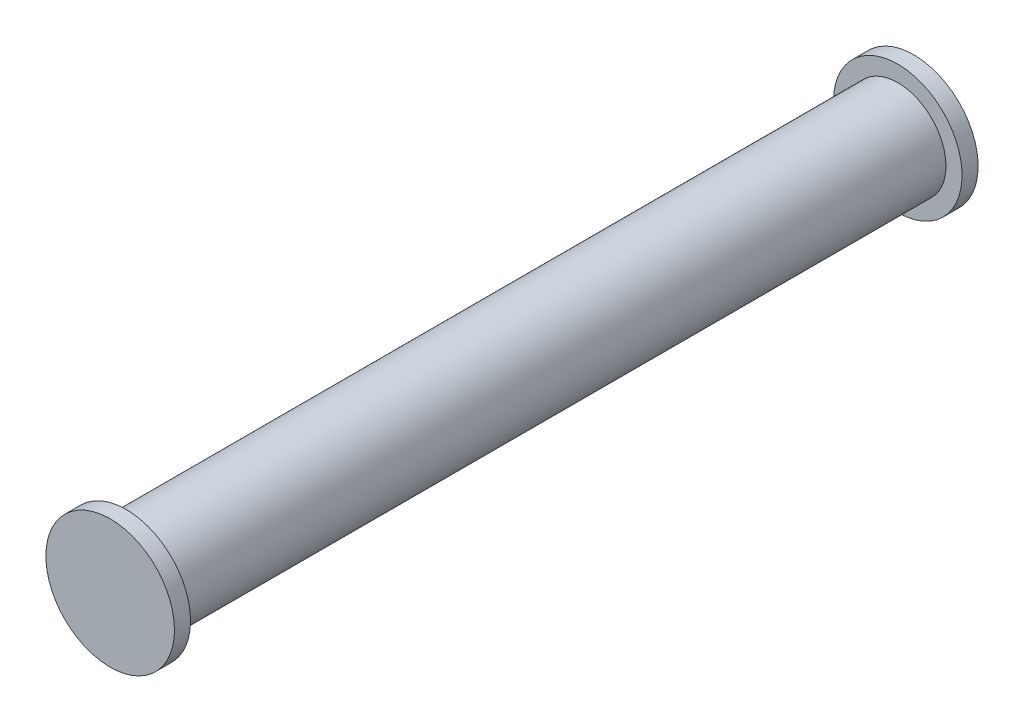
ISO-10303-21;
HEADER;
FILE_DESCRIPTION(('STEP AP214'),'2;1');
FILE_NAME('part.step','',(''),(''),'','','');
FILE_SCHEMA(('AUTOMOTIVE_DESIGN { 1 0 10303 214 1 1 1 1 }'));
ENDSEC;
DATA;
#1=APPLICATION_CONTEXT('core data for automotive mechanical design processes');
#2=APPLICATION_PROTOCOL_DEFINITION('international standard','automotive_design',2000,#1);
#3=PRODUCT_CONTEXT('',#1,'mechanical');
#4=PRODUCT('Part','Part','',(#3));
#5=PRODUCT_RELATED_PRODUCT_CATEGORY('part','',(#4));
#6=PRODUCT_DEFINITION_FORMATION('','',#4);
#7=PRODUCT_DEFINITION_CONTEXT('part definition',#1,'design');
#8=PRODUCT_DEFINITION('design','',#6,#7);
#9=PRODUCT_DEFINITION_SHAPE('','',#8);
#10=(LENGTH_UNIT() NAMED_UNIT(*) SI_UNIT(.MILLI.,.METRE.));
#11=(NAMED_UNIT(*) PLANE_ANGLE_UNIT() SI_UNIT($,.RADIAN.));
#12=(NAMED_UNIT(*) SI_UNIT($,.STERADIAN.) SOLID_ANGLE_UNIT());
#13=UNCERTAINTY_MEASURE_WITH_UNIT(LENGTH_MEASURE(1.E-05),#10,'distance_accuracy_value','');
#14=(GEOMETRIC_REPRESENTATION_CONTEXT(3) GLOBAL_UNCERTAINTY_ASSIGNED_CONTEXT((#13)) GLOBAL_UNIT_ASSIGNED_CONTEXT((#10,
#11,#12)) REPRESENTATION_CONTEXT('',''));
#15=CARTESIAN_POINT('',(0.,0.,0.));
#16=DIRECTION('',(0.,0.,1.));
#17=DIRECTION('',(1.,0.,0.));
#18=AXIS2_PLACEMENT_3D('',#15,#16,#17);
#19=CARTESIAN_POINT('',(0.,0.,304.8));
#20=DIRECTION('',(0.,0.,-1.));
#21=DIRECTION('',(-1.,0.,0.));
#22=AXIS2_PLACEMENT_3D('',#19,#20,#21);
#23=CYLINDRICAL_SURFACE('',#22,19.05);
#24=CARTESIAN_POINT('',(0.,0.,304.8));
#25=DIRECTION('',(0.,0.,1.));
#26=DIRECTION('',(1.,0.,0.));
#27=AXIS2_PLACEMENT_3D('',#24,#25,#26);
#28=CIRCLE('',#27,19.05);
#29=CARTESIAN_POINT('',(-19.05,0.,304.8));
#30=VERTEX_POINT('',#29);
#31=EDGE_CURVE('E10',#30,#30,#28,.T.);
#32=CARTESIAN_POINT('',(0.,0.,0.));
#33=DIRECTION('',(0.,0.,1.));
#34=DIRECTION('',(1.,0.,0.));
#35=AXIS2_PLACEMENT_3D('',#32,#33,#34);
#36=CIRCLE('',#35,19.05);
#37=CARTESIAN_POINT('',(-19.05,0.,0.));
#38=VERTEX_POINT('',#37);
#39=EDGE_CURVE('E40',#38,#38,#36,.T.);
#40=CARTESIAN_POINT('',(-19.05,0.,304.8));
#41=CARTESIAN_POINT('',(-19.05,0.,301.625));
#42=CARTESIAN_POINT('',(-19.05,0.,298.45));
#43=CARTESIAN_POINT('',(-19.05,0.,292.1));
#44=CARTESIAN_POINT('',(-19.05,0.,288.925));
#45=CARTESIAN_POINT('',(-19.05,0.,282.575));
#46=CARTESIAN_POINT('',(-19.05,0.,279.4));
#47=CARTESIAN_POINT('',(-19.05,0.,273.05));
#48=CARTESIAN_POINT('',(-19.05,0.,269.875));
#49=CARTESIAN_POINT('',(-19.05,0.,263.525));
#50=CARTESIAN_POINT('',(-19.05,0.,260.35));
#51=CARTESIAN_POINT('',(-19.05,0.,254.));
#52=CARTESIAN_POINT('',(-19.05,0.,250.825));
#53=CARTESIAN_POINT('',(-19.05,0.,244.475));
#54=CARTESIAN_POINT('',(-19.05,0.,241.3));
#55=CARTESIAN_POINT('',(-19.05,0.,234.95));
#56=CARTESIAN_POINT('',(-19.05,0.,231.775));
#57=CARTESIAN_POINT('',(-19.05,0.,225.425));
#58=CARTESIAN_POINT('',(-19.05,0.,222.25));
#59=CARTESIAN_POINT('',(-19.05,0.,215.9));
#60=CARTESIAN_POINT('',(-19.05,0.,212.725));
#61=CARTESIAN_POINT('',(-19.05,0.,206.375));
#62=CARTESIAN_POINT('',(-19.05,0.,203.2));
#63=CARTESIAN_POINT('',(-19.05,0.,196.85));
#64=CARTESIAN_POINT('',(-19.05,0.,193.675));
#65=CARTESIAN_POINT('',(-19.05,0.,187.325));
#66=CARTESIAN_POINT('',(-19.05,0.,184.15));
#67=CARTESIAN_POINT('',(-19.05,0.,177.8));
#68=CARTESIAN_POINT('',(-19.05,0.,174.625));
#69=CARTESIAN_POINT('',(-19.05,0.,168.275));
#70=CARTESIAN_POINT('',(-19.05,0.,165.1));
#71=CARTESIAN_POINT('',(-19.05,0.,158.75));
#72=CARTESIAN_POINT('',(-19.05,0.,155.575));
#73=CARTESIAN_POINT('',(-19.05,0.,149.225));
#74=CARTESIAN_POINT('',(-19.05,0.,146.05));
#75=CARTESIAN_POINT('',(-19.05,0.,139.7));
#76=CARTESIAN_POINT('',(-19.05,0.,136.525));
#77=CARTESIAN_POINT('',(-19.05,0.,130.175));
#78=CARTESIAN_POINT('',(-19.05,0.,127.));
#79=CARTESIAN_POINT('',(-19.05,0.,120.65));
#80=CARTESIAN_POINT('',(-19.05,0.,117.475));
#81=CARTESIAN_POINT('',(-19.05,0.,111.125));
#82=CARTESIAN_POINT('',(-19.05,0.,107.95));
#83=CARTESIAN_POINT('',(-19.05,0.,101.6));
#84=CARTESIAN_POINT('',(-19.05,0.,98.425));
#85=CARTESIAN_POINT('',(-19.05,0.,92.075));
#86=CARTESIAN_POINT('',(-19.05,0.,88.9));
#87=CARTESIAN_POINT('',(-19.05,0.,82.55));
#88=CARTESIAN_POINT('',(-19.05,0.,79.375));
#89=CARTESIAN_POINT('',(-19.05,0.,73.025));
#90=CARTESIAN_POINT('',(-19.05,0.,69.85));
#91=CARTESIAN_POINT('',(-19.05,0.,63.5));
#92=CARTESIAN_POINT('',(-19.05,0.,60.325));
#93=CARTESIAN_POINT('',(-19.05,0.,53.975));
#94=CARTESIAN_POINT('',(-19.05,0.,50.8));
#95=CARTESIAN_POINT('',(-19.05,0.,44.45));
#96=CARTESIAN_POINT('',(-19.05,0.,41.275));
#97=CARTESIAN_POINT('',(-19.05,0.,34.925));
#98=CARTESIAN_POINT('',(-19.05,0.,31.75));
#99=CARTESIAN_POINT('',(-19.05,0.,25.4));
#100=CARTESIAN_POINT('',(-19.05,0.,22.225));
#101=CARTESIAN_POINT('',(-19.05,0.,15.875));
#102=CARTESIAN_POINT('',(-19.05,0.,12.7));
#103=CARTESIAN_POINT('',(-19.05,0.,6.35));
#104=CARTESIAN_POINT('',(-19.05,0.,3.175));
#105=CARTESIAN_POINT('',(-19.05,0.,0.));
#106=B_SPLINE_CURVE_WITH_KNOTS('',3,(#40,#41,#42,#43,#44,#45,#46,#47,#48,#49,#50,#51,#52,#53,
#54,#55,#56,#57,#58,#59,#60,#61,#62,#63,#64,#65,#66,#67,#68,#69,#70,#71,#72,#73,#74,#75,#76,#77,
#78,#79,#80,#81,#82,#83,#84,#85,#86,#87,#88,#89,#90,#91,#92,#93,#94,#95,#96,#97,#98,#99,#100,
#101,#102,#103,#104,#105),.UNSPECIFIED.,.F.,.F.,(4,2,2,2,2,2,2,2,2,2,2,2,2,2,2,2,2,2,2,2,2,2,2,
2,2,2,2,2,2,2,2,2,4),(0.,9.52500000000001,19.05,28.575,38.1,47.625,57.15,66.675,76.2,
85.7250000000001,95.2500000000001,104.775,114.3,123.825,133.35,142.875,152.4,161.925,171.45,
180.975,190.5,200.025,209.55,219.075,228.6,238.125,247.65,257.175,266.7,276.225,285.75,295.275,
304.8),.UNSPECIFIED.);
#107=EDGE_CURVE('BSEAM37',#30,#38,#106,.T.);
#108=ORIENTED_EDGE('',*,*,#31,.F.);
#109=ORIENTED_EDGE('',*,*,#39,.T.);
#110=ORIENTED_EDGE('',*,*,#107,.T.);
#111=ORIENTED_EDGE('',*,*,#107,.F.);
#112=EDGE_LOOP('',(#108,#110,#109,#111));
#113=FACE_BOUND('',#112,.T.);
#114=ADVANCED_FACE('F37',(#113),#23,.T.);
#115=CARTESIAN_POINT('',(0.,0.,311.15));
#116=DIRECTION('',(0.,0.,-1.));
#117=DIRECTION('',(-1.,0.,0.));
#118=AXIS2_PLACEMENT_3D('',#115,#116,#117);
#119=CYLINDRICAL_SURFACE('',#118,25.4);
#120=CARTESIAN_POINT('',(0.,0.,311.15));
#121=DIRECTION('',(0.,0.,1.));
#122=DIRECTION('',(1.,0.,0.));
#123=AXIS2_PLACEMENT_3D('',#120,#121,#122);
#124=CIRCLE('',#123,25.4);
#125=CARTESIAN_POINT('',(25.4,0.,311.15));
#126=VERTEX_POINT('',#125);
#127=EDGE_CURVE('E45',#126,#126,#124,.T.);
#128=ORIENTED_EDGE('',*,*,#127,.F.);
#129=EDGE_LOOP('',(#128));
#130=FACE_BOUND('',#129,.T.);
#131=CARTESIAN_POINT('',(0.,0.,304.8));
#132=DIRECTION('',(0.,0.,1.));
#133=DIRECTION('',(1.,0.,0.));
#134=AXIS2_PLACEMENT_3D('',#131,#132,#133);
#135=CIRCLE('',#134,25.4);
#136=CARTESIAN_POINT('',(25.4,0.,304.8));
#137=VERTEX_POINT('',#136);
#138=EDGE_CURVE('E50',#137,#137,#135,.T.);
#139=ORIENTED_EDGE('',*,*,#138,.T.);
#140=EDGE_LOOP('',(#139));
#141=FACE_BOUND('',#140,.T.);
#142=ADVANCED_FACE('F91',(#130,#141),#119,.T.);
#143=CARTESIAN_POINT('',(0.,0.,311.15));
#144=DIRECTION('',(0.,0.,1.));
#145=DIRECTION('',(1.,0.,0.));
#146=AXIS2_PLACEMENT_3D('',#143,#144,#145);
#147=PLANE('',#146);
#148=ORIENTED_EDGE('',*,*,#127,.T.);
#149=EDGE_LOOP('',(#148));
#150=FACE_BOUND('',#149,.T.);
#151=ADVANCED_FACE('F87',(#150),#147,.T.);
#152=CARTESIAN_POINT('',(0.,0.,304.8));
#153=DIRECTION('',(0.,0.,1.));
#154=DIRECTION('',(1.,0.,0.));
#155=AXIS2_PLACEMENT_3D('',#152,#153,#154);
#156=PLANE('',#155);
#157=ORIENTED_EDGE('',*,*,#31,.T.);
#158=EDGE_LOOP('',(#157));
#159=FACE_BOUND('',#158,.T.);
#160=ORIENTED_EDGE('',*,*,#138,.F.);
#161=EDGE_LOOP('',(#160));
#162=FACE_BOUND('',#161,.T.);
#163=ADVANCED_FACE('F79',(#159,#162),#156,.F.);
#164=CARTESIAN_POINT('',(0.,0.,-6.35));
#165=DIRECTION('',(0.,0.,1.));
#166=DIRECTION('',(1.,0.,0.));
#167=AXIS2_PLACEMENT_3D('',#164,#165,#166);
#168=CYLINDRICAL_SURFACE('',#167,25.4);
#169=CARTESIAN_POINT('',(0.,0.,-6.35));
#170=DIRECTION('',(0.,0.,-1.));
#171=DIRECTION('',(-1.,0.,0.));
#172=AXIS2_PLACEMENT_3D('',#169,#170,#171);
#173=CIRCLE('',#172,25.4);
#174=CARTESIAN_POINT('',(-25.4,0.,-6.35));
#175=VERTEX_POINT('',#174);
#176=EDGE_CURVE('E60',#175,#175,#173,.T.);
#177=ORIENTED_EDGE('',*,*,#176,.F.);
#178=EDGE_LOOP('',(#177));
#179=FACE_BOUND('',#178,.T.);
#180=CARTESIAN_POINT('',(0.,0.,0.));
#181=DIRECTION('',(0.,0.,-1.));
#182=DIRECTION('',(-1.,0.,0.));
#183=AXIS2_PLACEMENT_3D('',#180,#181,#182);
#184=CIRCLE('',#183,25.4);
#185=CARTESIAN_POINT('',(-25.4,0.,0.));
#186=VERTEX_POINT('',#185);
#187=EDGE_CURVE('E56',#186,#186,#184,.T.);
#188=ORIENTED_EDGE('',*,*,#187,.T.);
#189=EDGE_LOOP('',(#188));
#190=FACE_BOUND('',#189,.T.);
#191=ADVANCED_FACE('F77',(#179,#190),#168,.T.);
#192=CARTESIAN_POINT('',(0.,0.,-6.35));
#193=DIRECTION('',(0.,0.,-1.));
#194=DIRECTION('',(-1.,0.,0.));
#195=AXIS2_PLACEMENT_3D('',#192,#193,#194);
#196=PLANE('',#195);
#197=ORIENTED_EDGE('',*,*,#176,.T.);
#198=EDGE_LOOP('',(#197));
#199=FACE_BOUND('',#198,.T.);
#200=ADVANCED_FACE('F73',(#199),#196,.T.);
#201=CARTESIAN_POINT('',(0.,0.,0.));
#202=DIRECTION('',(0.,0.,-1.));
#203=DIRECTION('',(-1.,0.,0.));
#204=AXIS2_PLACEMENT_3D('',#201,#202,#203);
#205=PLANE('',#204);
#206=ORIENTED_EDGE('',*,*,#39,.F.);
#207=EDGE_LOOP('',(#206));
#208=FACE_BOUND('',#207,.T.);
#209=ORIENTED_EDGE('',*,*,#187,.F.);
#210=EDGE_LOOP('',(#209));
#211=FACE_BOUND('',#210,.T.);
#212=ADVANCED_FACE('F70',(#208,#211),#205,.F.);
#213=CLOSED_SHELL('',(#114,#142,#151,#163,#191,#200,#212));
#214=MANIFOLD_SOLID_BREP('B2',#213);
#215=ADVANCED_BREP_SHAPE_REPRESENTATION('',(#18,#214),#14);
#216=SHAPE_DEFINITION_REPRESENTATION(#9,#215);
ENDSEC;
END-ISO-10303-21;
